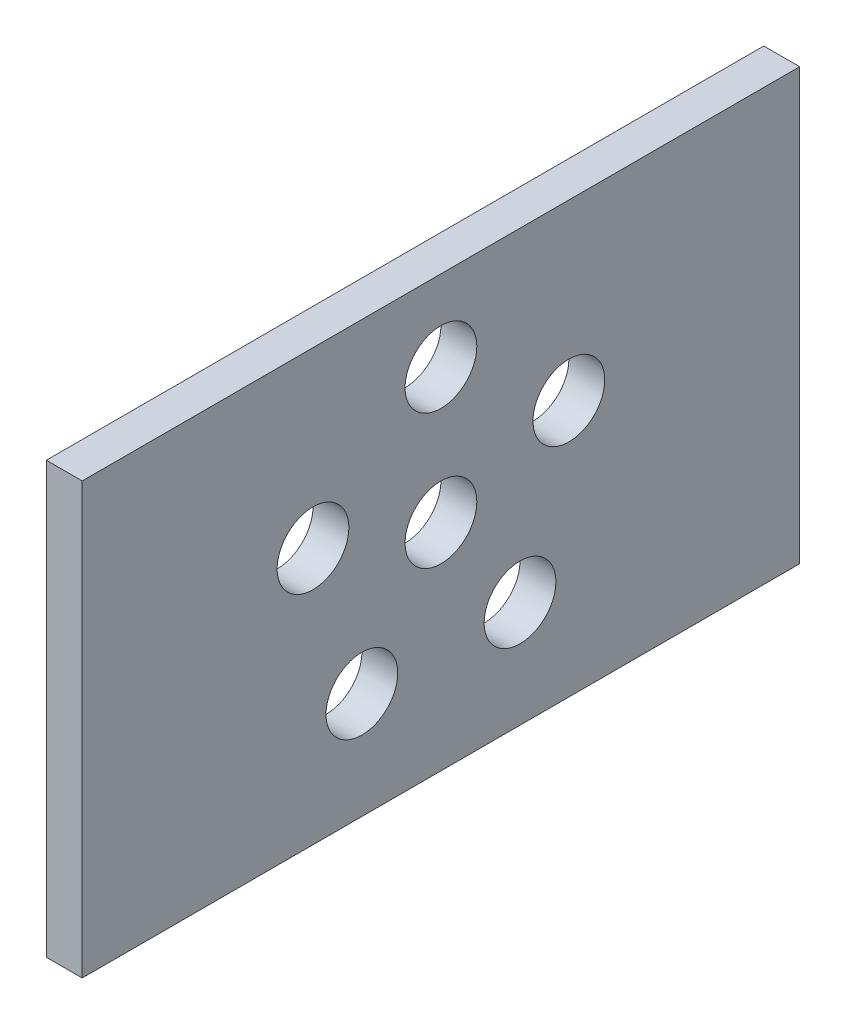
ISO-10303-21;
HEADER;
FILE_DESCRIPTION(('STEP AP214'),'2;1');
FILE_NAME('part.step','',(''),(''),'','','');
FILE_SCHEMA(('AUTOMOTIVE_DESIGN { 1 0 10303 214 1 1 1 1 }'));
ENDSEC;
DATA;
#1=APPLICATION_CONTEXT('core data for automotive mechanical design processes');
#2=APPLICATION_PROTOCOL_DEFINITION('international standard','automotive_design',2000,#1);
#3=PRODUCT_CONTEXT('',#1,'mechanical');
#4=PRODUCT('Part','Part','',(#3));
#5=PRODUCT_RELATED_PRODUCT_CATEGORY('part','',(#4));
#6=PRODUCT_DEFINITION_FORMATION('','',#4);
#7=PRODUCT_DEFINITION_CONTEXT('part definition',#1,'design');
#8=PRODUCT_DEFINITION('design','',#6,#7);
#9=PRODUCT_DEFINITION_SHAPE('','',#8);
#10=(LENGTH_UNIT() NAMED_UNIT(*) SI_UNIT(.MILLI.,.METRE.));
#11=(NAMED_UNIT(*) PLANE_ANGLE_UNIT() SI_UNIT($,.RADIAN.));
#12=(NAMED_UNIT(*) SI_UNIT($,.STERADIAN.) SOLID_ANGLE_UNIT());
#13=UNCERTAINTY_MEASURE_WITH_UNIT(LENGTH_MEASURE(1.E-05),#10,'distance_accuracy_value','');
#14=(GEOMETRIC_REPRESENTATION_CONTEXT(3) GLOBAL_UNCERTAINTY_ASSIGNED_CONTEXT((#13)) GLOBAL_UNIT_ASSIGNED_CONTEXT((#10,
#11,#12)) REPRESENTATION_CONTEXT('',''));
#15=CARTESIAN_POINT('',(0.,0.,0.));
#16=DIRECTION('',(0.,0.,1.));
#17=DIRECTION('',(1.,0.,0.));
#18=AXIS2_PLACEMENT_3D('',#15,#16,#17);
#19=CARTESIAN_POINT('',(3.175,19.05,-31.75));
#20=DIRECTION('',(-1.,0.,0.));
#21=DIRECTION('',(0.,0.,1.));
#22=AXIS2_PLACEMENT_3D('',#19,#20,#21);
#23=PLANE('',#22);
#24=CARTESIAN_POINT('',(3.175,3.67923358927685,-11.3235166471391));
#25=DIRECTION('',(1.,0.,0.));
#26=DIRECTION('',(0.,-0.95105651629515,-0.309016994374958));
#27=AXIS2_PLACEMENT_3D('',#24,#25,#26);
#28=CIRCLE('',#27,3.175);
#29=CARTESIAN_POINT('',(3.175,0.659629150039745,-12.3046456042796));
#30=VERTEX_POINT('',#29);
#31=EDGE_CURVE('E133',#30,#30,#28,.T.);
#32=ORIENTED_EDGE('',*,*,#31,.F.);
#33=EDGE_LOOP('',(#32));
#34=FACE_BOUND('',#33,.T.);
#35=CARTESIAN_POINT('',(3.175,-9.63235858927666,-6.99831816010734));
#36=DIRECTION('',(1.,0.,0.));
#37=DIRECTION('',(0.,-0.58778525229248,0.809016994374942));
#38=AXIS2_PLACEMENT_3D('',#35,#36,#37);
#39=CIRCLE('',#38,3.175);
#40=CARTESIAN_POINT('',(3.175,-11.4985767653053,-4.4296892029669));
#41=VERTEX_POINT('',#40);
#42=EDGE_CURVE('E139',#41,#41,#39,.T.);
#43=ORIENTED_EDGE('',*,*,#42,.F.);
#44=EDGE_LOOP('',(#43));
#45=FACE_BOUND('',#44,.T.);
#46=CARTESIAN_POINT('',(3.175,-9.63235858927676,6.9983181601072));
#47=DIRECTION('',(1.,0.,0.));
#48=DIRECTION('',(0.,0.587785252292469,0.809016994374951));
#49=AXIS2_PLACEMENT_3D('',#46,#47,#48);
#50=CIRCLE('',#49,3.175);
#51=CARTESIAN_POINT('',(3.175,-7.76614041324817,9.56694711724767));
#52=VERTEX_POINT('',#51);
#53=EDGE_CURVE('E127',#52,#52,#50,.T.);
#54=ORIENTED_EDGE('',*,*,#53,.F.);
#55=EDGE_LOOP('',(#54));
#56=FACE_BOUND('',#55,.T.);
#57=CARTESIAN_POINT('',(3.175,3.67923358927669,11.3235166471392));
#58=DIRECTION('',(1.,0.,0.));
#59=DIRECTION('',(0.,0.951056516295155,-0.309016994374945));
#60=AXIS2_PLACEMENT_3D('',#57,#58,#59);
#61=CIRCLE('',#60,3.175);
#62=CARTESIAN_POINT('',(3.175,6.6988380285138,10.3423876899987));
#63=VERTEX_POINT('',#62);
#64=EDGE_CURVE('E121',#63,#63,#61,.T.);
#65=ORIENTED_EDGE('',*,*,#64,.F.);
#66=EDGE_LOOP('',(#65));
#67=FACE_BOUND('',#66,.T.);
#68=CARTESIAN_POINT('',(3.175,11.90625,0.));
#69=DIRECTION('',(1.,0.,0.));
#70=DIRECTION('',(0.,0.,-1.));
#71=AXIS2_PLACEMENT_3D('',#68,#69,#70);
#72=CIRCLE('',#71,3.175);
#73=CARTESIAN_POINT('',(3.175,11.90625,-3.175));
#74=VERTEX_POINT('',#73);
#75=EDGE_CURVE('E115',#74,#74,#72,.T.);
#76=ORIENTED_EDGE('',*,*,#75,.F.);
#77=EDGE_LOOP('',(#76));
#78=FACE_BOUND('',#77,.T.);
#79=DIRECTION('',(0.,1.,0.));
#80=VECTOR('',#79,1.);
#81=CARTESIAN_POINT('',(3.175,-19.05,-31.75));
#82=LINE('',#81,#80);
#83=CARTESIAN_POINT('',(3.175,-19.05,-31.75));
#84=VERTEX_POINT('',#83);
#85=CARTESIAN_POINT('',(3.175,19.05,-31.75));
#86=VERTEX_POINT('',#85);
#87=EDGE_CURVE('E85',#84,#86,#82,.T.);
#88=ORIENTED_EDGE('',*,*,#87,.T.);
#89=DIRECTION('',(0.,0.,1.));
#90=VECTOR('',#89,1.);
#91=CARTESIAN_POINT('',(3.175,19.05,31.75));
#92=LINE('',#91,#90);
#93=CARTESIAN_POINT('',(3.175,19.05,31.75));
#94=VERTEX_POINT('',#93);
#95=EDGE_CURVE('E80',#86,#94,#92,.T.);
#96=ORIENTED_EDGE('',*,*,#95,.T.);
#97=DIRECTION('',(0.,-1.,0.));
#98=VECTOR('',#97,1.);
#99=CARTESIAN_POINT('',(3.175,-19.05,31.75));
#100=LINE('',#99,#98);
#101=CARTESIAN_POINT('',(3.175,-19.05,31.75));
#102=VERTEX_POINT('',#101);
#103=EDGE_CURVE('E83',#94,#102,#100,.T.);
#104=ORIENTED_EDGE('',*,*,#103,.T.);
#105=DIRECTION('',(0.,0.,-1.));
#106=VECTOR('',#105,1.);
#107=CARTESIAN_POINT('',(3.175,-19.05,31.75));
#108=LINE('',#107,#106);
#109=EDGE_CURVE('E50',#102,#84,#108,.T.);
#110=ORIENTED_EDGE('',*,*,#109,.T.);
#111=EDGE_LOOP('',(#88,#96,#104,#110));
#112=FACE_BOUND('',#111,.T.);
#113=CARTESIAN_POINT('',(3.175,0.,0.));
#114=DIRECTION('',(1.,0.,0.));
#115=DIRECTION('',(0.,0.,-1.));
#116=AXIS2_PLACEMENT_3D('',#113,#114,#115);
#117=CIRCLE('',#116,3.175);
#118=CARTESIAN_POINT('',(3.175,0.,-3.175));
#119=VERTEX_POINT('',#118);
#120=EDGE_CURVE('E100',#119,#119,#117,.T.);
#121=ORIENTED_EDGE('',*,*,#120,.F.);
#122=EDGE_LOOP('',(#121));
#123=FACE_BOUND('',#122,.T.);
#124=ADVANCED_FACE('F33',(#34,#45,#56,#67,#78,#112,#123),#23,.F.);
#125=CARTESIAN_POINT('',(0.,19.05,-31.75));
#126=DIRECTION('',(-1.,0.,0.));
#127=DIRECTION('',(0.,0.,1.));
#128=AXIS2_PLACEMENT_3D('',#125,#126,#127);
#129=PLANE('',#128);
#130=CARTESIAN_POINT('',(0.,3.67923358927685,-11.3235166471391));
#131=DIRECTION('',(1.,0.,0.));
#132=DIRECTION('',(0.,-0.95105651629515,-0.309016994374958));
#133=AXIS2_PLACEMENT_3D('',#130,#131,#132);
#134=CIRCLE('',#133,3.175);
#135=CARTESIAN_POINT('',(0.,0.659629150039745,-12.3046456042796));
#136=VERTEX_POINT('',#135);
#137=EDGE_CURVE('E130',#136,#136,#134,.T.);
#138=ORIENTED_EDGE('',*,*,#137,.T.);
#139=EDGE_LOOP('',(#138));
#140=FACE_BOUND('',#139,.T.);
#141=CARTESIAN_POINT('',(0.,-9.63235858927666,-6.99831816010734));
#142=DIRECTION('',(1.,0.,0.));
#143=DIRECTION('',(0.,-0.58778525229248,0.809016994374942));
#144=AXIS2_PLACEMENT_3D('',#141,#142,#143);
#145=CIRCLE('',#144,3.175);
#146=CARTESIAN_POINT('',(0.,-11.4985767653053,-4.4296892029669));
#147=VERTEX_POINT('',#146);
#148=EDGE_CURVE('E136',#147,#147,#145,.T.);
#149=ORIENTED_EDGE('',*,*,#148,.T.);
#150=EDGE_LOOP('',(#149));
#151=FACE_BOUND('',#150,.T.);
#152=CARTESIAN_POINT('',(0.,-9.63235858927676,6.9983181601072));
#153=DIRECTION('',(1.,0.,0.));
#154=DIRECTION('',(0.,0.587785252292469,0.809016994374951));
#155=AXIS2_PLACEMENT_3D('',#152,#153,#154);
#156=CIRCLE('',#155,3.175);
#157=CARTESIAN_POINT('',(0.,-7.76614041324817,9.56694711724767));
#158=VERTEX_POINT('',#157);
#159=EDGE_CURVE('E142',#158,#158,#156,.T.);
#160=ORIENTED_EDGE('',*,*,#159,.T.);
#161=EDGE_LOOP('',(#160));
#162=FACE_BOUND('',#161,.T.);
#163=CARTESIAN_POINT('',(0.,3.67923358927669,11.3235166471392));
#164=DIRECTION('',(1.,0.,0.));
#165=DIRECTION('',(0.,0.951056516295155,-0.309016994374945));
#166=AXIS2_PLACEMENT_3D('',#163,#164,#165);
#167=CIRCLE('',#166,3.175);
#168=CARTESIAN_POINT('',(0.,6.6988380285138,10.3423876899987));
#169=VERTEX_POINT('',#168);
#170=EDGE_CURVE('E124',#169,#169,#167,.T.);
#171=ORIENTED_EDGE('',*,*,#170,.T.);
#172=EDGE_LOOP('',(#171));
#173=FACE_BOUND('',#172,.T.);
#174=CARTESIAN_POINT('',(0.,11.90625,0.));
#175=DIRECTION('',(1.,0.,0.));
#176=DIRECTION('',(0.,0.,-1.));
#177=AXIS2_PLACEMENT_3D('',#174,#175,#176);
#178=CIRCLE('',#177,3.175);
#179=CARTESIAN_POINT('',(0.,11.90625,-3.175));
#180=VERTEX_POINT('',#179);
#181=EDGE_CURVE('E118',#180,#180,#178,.T.);
#182=ORIENTED_EDGE('',*,*,#181,.T.);
#183=EDGE_LOOP('',(#182));
#184=FACE_BOUND('',#183,.T.);
#185=DIRECTION('',(0.,1.,0.));
#186=VECTOR('',#185,1.);
#187=CARTESIAN_POINT('',(0.,-19.05,-31.75));
#188=LINE('',#187,#186);
#189=CARTESIAN_POINT('',(0.,-19.05,-31.75));
#190=VERTEX_POINT('',#189);
#191=CARTESIAN_POINT('',(0.,19.05,-31.75));
#192=VERTEX_POINT('',#191);
#193=EDGE_CURVE('E97',#190,#192,#188,.T.);
#194=ORIENTED_EDGE('',*,*,#193,.F.);
#195=DIRECTION('',(0.,0.,-1.));
#196=VECTOR('',#195,1.);
#197=CARTESIAN_POINT('',(0.,-19.05,31.75));
#198=LINE('',#197,#196);
#199=CARTESIAN_POINT('',(0.,-19.05,31.75));
#200=VERTEX_POINT('',#199);
#201=EDGE_CURVE('E73',#200,#190,#198,.T.);
#202=ORIENTED_EDGE('',*,*,#201,.F.);
#203=DIRECTION('',(0.,-1.,0.));
#204=VECTOR('',#203,1.);
#205=CARTESIAN_POINT('',(0.,-19.05,31.75));
#206=LINE('',#205,#204);
#207=CARTESIAN_POINT('',(0.,19.05,31.75));
#208=VERTEX_POINT('',#207);
#209=EDGE_CURVE('E67',#208,#200,#206,.T.);
#210=ORIENTED_EDGE('',*,*,#209,.F.);
#211=DIRECTION('',(0.,0.,1.));
#212=VECTOR('',#211,1.);
#213=CARTESIAN_POINT('',(0.,19.05,31.75));
#214=LINE('',#213,#212);
#215=EDGE_CURVE('E89',#192,#208,#214,.T.);
#216=ORIENTED_EDGE('',*,*,#215,.F.);
#217=EDGE_LOOP('',(#194,#202,#210,#216));
#218=FACE_BOUND('',#217,.T.);
#219=CARTESIAN_POINT('',(0.,0.,0.));
#220=DIRECTION('',(1.,0.,0.));
#221=DIRECTION('',(0.,0.,-1.));
#222=AXIS2_PLACEMENT_3D('',#219,#220,#221);
#223=CIRCLE('',#222,3.175);
#224=CARTESIAN_POINT('',(0.,0.,-3.175));
#225=VERTEX_POINT('',#224);
#226=EDGE_CURVE('E112',#225,#225,#223,.T.);
#227=ORIENTED_EDGE('',*,*,#226,.T.);
#228=EDGE_LOOP('',(#227));
#229=FACE_BOUND('',#228,.T.);
#230=ADVANCED_FACE('F108',(#140,#151,#162,#173,#184,#218,#229),#129,.T.);
#231=CARTESIAN_POINT('',(3.175,-19.05,-31.75));
#232=DIRECTION('',(0.,0.,1.));
#233=DIRECTION('',(1.,0.,0.));
#234=AXIS2_PLACEMENT_3D('',#231,#232,#233);
#235=PLANE('',#234);
#236=ORIENTED_EDGE('',*,*,#193,.T.);
#237=DIRECTION('',(-1.,0.,0.));
#238=VECTOR('',#237,1.);
#239=CARTESIAN_POINT('',(3.175,19.05,-31.75));
#240=LINE('',#239,#238);
#241=EDGE_CURVE('E11',#86,#192,#240,.T.);
#242=ORIENTED_EDGE('',*,*,#241,.F.);
#243=ORIENTED_EDGE('',*,*,#87,.F.);
#244=DIRECTION('',(-1.,0.,0.));
#245=VECTOR('',#244,1.);
#246=CARTESIAN_POINT('',(3.175,-19.05,-31.75));
#247=LINE('',#246,#245);
#248=EDGE_CURVE('E93',#84,#190,#247,.T.);
#249=ORIENTED_EDGE('',*,*,#248,.T.);
#250=EDGE_LOOP('',(#236,#242,#243,#249));
#251=FACE_BOUND('',#250,.T.);
#252=ADVANCED_FACE('F35',(#251),#235,.F.);
#253=CARTESIAN_POINT('',(3.175,19.05,31.75));
#254=DIRECTION('',(0.,-1.,0.));
#255=DIRECTION('',(0.,0.,-1.));
#256=AXIS2_PLACEMENT_3D('',#253,#254,#255);
#257=PLANE('',#256);
#258=ORIENTED_EDGE('',*,*,#215,.T.);
#259=DIRECTION('',(-1.,0.,0.));
#260=VECTOR('',#259,1.);
#261=CARTESIAN_POINT('',(3.175,19.05,31.75));
#262=LINE('',#261,#260);
#263=EDGE_CURVE('E42',#94,#208,#262,.T.);
#264=ORIENTED_EDGE('',*,*,#263,.F.);
#265=ORIENTED_EDGE('',*,*,#95,.F.);
#266=ORIENTED_EDGE('',*,*,#241,.T.);
#267=EDGE_LOOP('',(#258,#264,#265,#266));
#268=FACE_BOUND('',#267,.T.);
#269=ADVANCED_FACE('F88',(#268),#257,.F.);
#270=CARTESIAN_POINT('',(3.175,-19.05,31.75));
#271=DIRECTION('',(0.,0.,-1.));
#272=DIRECTION('',(-1.,0.,0.));
#273=AXIS2_PLACEMENT_3D('',#270,#271,#272);
#274=PLANE('',#273);
#275=ORIENTED_EDGE('',*,*,#209,.T.);
#276=DIRECTION('',(-1.,0.,0.));
#277=VECTOR('',#276,1.);
#278=CARTESIAN_POINT('',(3.175,-19.05,31.75));
#279=LINE('',#278,#277);
#280=EDGE_CURVE('E90',#102,#200,#279,.T.);
#281=ORIENTED_EDGE('',*,*,#280,.F.);
#282=ORIENTED_EDGE('',*,*,#103,.F.);
#283=ORIENTED_EDGE('',*,*,#263,.T.);
#284=EDGE_LOOP('',(#275,#281,#282,#283));
#285=FACE_BOUND('',#284,.T.);
#286=ADVANCED_FACE('F91',(#285),#274,.F.);
#287=CARTESIAN_POINT('',(3.175,-19.05,31.75));
#288=DIRECTION('',(0.,1.,0.));
#289=DIRECTION('',(0.,0.,1.));
#290=AXIS2_PLACEMENT_3D('',#287,#288,#289);
#291=PLANE('',#290);
#292=ORIENTED_EDGE('',*,*,#201,.T.);
#293=ORIENTED_EDGE('',*,*,#248,.F.);
#294=ORIENTED_EDGE('',*,*,#109,.F.);
#295=ORIENTED_EDGE('',*,*,#280,.T.);
#296=EDGE_LOOP('',(#292,#293,#294,#295));
#297=FACE_BOUND('',#296,.T.);
#298=ADVANCED_FACE('F105',(#297),#291,.F.);
#299=CARTESIAN_POINT('',(3.175,0.,0.));
#300=DIRECTION('',(-1.,0.,0.));
#301=DIRECTION('',(0.,0.,1.));
#302=AXIS2_PLACEMENT_3D('',#299,#300,#301);
#303=CYLINDRICAL_SURFACE('',#302,3.175);
#304=ORIENTED_EDGE('',*,*,#120,.T.);
#305=EDGE_LOOP('',(#304));
#306=FACE_BOUND('',#305,.T.);
#307=ORIENTED_EDGE('',*,*,#226,.F.);
#308=EDGE_LOOP('',(#307));
#309=FACE_BOUND('',#308,.T.);
#310=ADVANCED_FACE('F163',(#306,#309),#303,.F.);
#311=CARTESIAN_POINT('',(3.175,11.90625,0.));
#312=DIRECTION('',(-1.,0.,0.));
#313=DIRECTION('',(0.,0.,1.));
#314=AXIS2_PLACEMENT_3D('',#311,#312,#313);
#315=CYLINDRICAL_SURFACE('',#314,3.175);
#316=ORIENTED_EDGE('',*,*,#75,.T.);
#317=EDGE_LOOP('',(#316));
#318=FACE_BOUND('',#317,.T.);
#319=ORIENTED_EDGE('',*,*,#181,.F.);
#320=EDGE_LOOP('',(#319));
#321=FACE_BOUND('',#320,.T.);
#322=ADVANCED_FACE('F159',(#318,#321),#315,.F.);
#323=CARTESIAN_POINT('',(3.175,3.67923358927669,11.3235166471392));
#324=DIRECTION('',(-1.,0.,0.));
#325=DIRECTION('',(0.,0.,1.));
#326=AXIS2_PLACEMENT_3D('',#323,#324,#325);
#327=CYLINDRICAL_SURFACE('',#326,3.175);
#328=ORIENTED_EDGE('',*,*,#64,.T.);
#329=EDGE_LOOP('',(#328));
#330=FACE_BOUND('',#329,.T.);
#331=ORIENTED_EDGE('',*,*,#170,.F.);
#332=EDGE_LOOP('',(#331));
#333=FACE_BOUND('',#332,.T.);
#334=ADVANCED_FACE('F162',(#330,#333),#327,.F.);
#335=CARTESIAN_POINT('',(3.175,-9.63235858927676,6.9983181601072));
#336=DIRECTION('',(-1.,0.,0.));
#337=DIRECTION('',(0.,0.,1.));
#338=AXIS2_PLACEMENT_3D('',#335,#336,#337);
#339=CYLINDRICAL_SURFACE('',#338,3.175);
#340=ORIENTED_EDGE('',*,*,#53,.T.);
#341=EDGE_LOOP('',(#340));
#342=FACE_BOUND('',#341,.T.);
#343=ORIENTED_EDGE('',*,*,#159,.F.);
#344=EDGE_LOOP('',(#343));
#345=FACE_BOUND('',#344,.T.);
#346=ADVANCED_FACE('F148',(#342,#345),#339,.F.);
#347=CARTESIAN_POINT('',(3.175,-9.63235858927666,-6.99831816010734));
#348=DIRECTION('',(-1.,0.,0.));
#349=DIRECTION('',(0.,0.,1.));
#350=AXIS2_PLACEMENT_3D('',#347,#348,#349);
#351=CYLINDRICAL_SURFACE('',#350,3.175);
#352=ORIENTED_EDGE('',*,*,#42,.T.);
#353=EDGE_LOOP('',(#352));
#354=FACE_BOUND('',#353,.T.);
#355=ORIENTED_EDGE('',*,*,#148,.F.);
#356=EDGE_LOOP('',(#355));
#357=FACE_BOUND('',#356,.T.);
#358=ADVANCED_FACE('F216',(#354,#357),#351,.F.);
#359=CARTESIAN_POINT('',(3.175,3.67923358927685,-11.3235166471391));
#360=DIRECTION('',(-1.,0.,0.));
#361=DIRECTION('',(0.,0.,1.));
#362=AXIS2_PLACEMENT_3D('',#359,#360,#361);
#363=CYLINDRICAL_SURFACE('',#362,3.175);
#364=ORIENTED_EDGE('',*,*,#31,.T.);
#365=EDGE_LOOP('',(#364));
#366=FACE_BOUND('',#365,.T.);
#367=ORIENTED_EDGE('',*,*,#137,.F.);
#368=EDGE_LOOP('',(#367));
#369=FACE_BOUND('',#368,.T.);
#370=ADVANCED_FACE('F223',(#366,#369),#363,.F.);
#371=CLOSED_SHELL('',(#124,#230,#252,#269,#286,#298,#310,#322,#334,#346,#358,#370));
#372=MANIFOLD_SOLID_BREP('B2',#371);
#373=ADVANCED_BREP_SHAPE_REPRESENTATION('',(#18,#372),#14);
#374=SHAPE_DEFINITION_REPRESENTATION(#9,#373);
ENDSEC;
END-ISO-10303-21;
